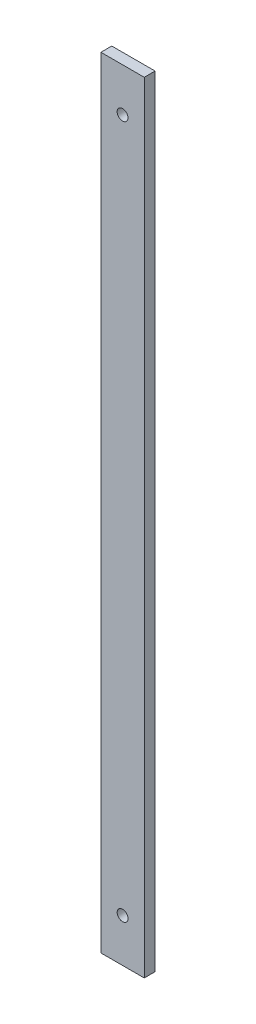
ISO-10303-21;
HEADER;
FILE_DESCRIPTION(('STEP AP214'),'2;1');
FILE_NAME('part.step','',(''),(''),'','','');
FILE_SCHEMA(('AUTOMOTIVE_DESIGN { 1 0 10303 214 1 1 1 1 }'));
ENDSEC;
DATA;
#1=APPLICATION_CONTEXT('core data for automotive mechanical design processes');
#2=APPLICATION_PROTOCOL_DEFINITION('international standard','automotive_design',2000,#1);
#3=PRODUCT_CONTEXT('',#1,'mechanical');
#4=PRODUCT('Part','Part','',(#3));
#5=PRODUCT_RELATED_PRODUCT_CATEGORY('part','',(#4));
#6=PRODUCT_DEFINITION_FORMATION('','',#4);
#7=PRODUCT_DEFINITION_CONTEXT('part definition',#1,'design');
#8=PRODUCT_DEFINITION('design','',#6,#7);
#9=PRODUCT_DEFINITION_SHAPE('','',#8);
#10=(LENGTH_UNIT() NAMED_UNIT(*) SI_UNIT(.MILLI.,.METRE.));
#11=(NAMED_UNIT(*) PLANE_ANGLE_UNIT() SI_UNIT($,.RADIAN.));
#12=(NAMED_UNIT(*) SI_UNIT($,.STERADIAN.) SOLID_ANGLE_UNIT());
#13=UNCERTAINTY_MEASURE_WITH_UNIT(LENGTH_MEASURE(1.E-05),#10,'distance_accuracy_value','');
#14=(GEOMETRIC_REPRESENTATION_CONTEXT(3) GLOBAL_UNCERTAINTY_ASSIGNED_CONTEXT((#13)) GLOBAL_UNIT_ASSIGNED_CONTEXT((#10,
#11,#12)) REPRESENTATION_CONTEXT('',''));
#15=CARTESIAN_POINT('',(0.,0.,0.));
#16=DIRECTION('',(0.,0.,1.));
#17=DIRECTION('',(1.,0.,0.));
#18=AXIS2_PLACEMENT_3D('',#15,#16,#17);
#19=CARTESIAN_POINT('',(-50.8,0.,25.4));
#20=DIRECTION('',(1.,0.,0.));
#21=DIRECTION('',(0.,0.,-1.));
#22=AXIS2_PLACEMENT_3D('',#19,#20,#21);
#23=PLANE('',#22);
#24=DIRECTION('',(0.,-1.,0.));
#25=VECTOR('',#24,1.);
#26=CARTESIAN_POINT('',(-50.8,0.,0.));
#27=LINE('',#26,#25);
#28=CARTESIAN_POINT('',(-50.8,1828.8,0.));
#29=VERTEX_POINT('',#28);
#30=CARTESIAN_POINT('',(-50.8,0.,0.));
#31=VERTEX_POINT('',#30);
#32=EDGE_CURVE('E98',#29,#31,#27,.T.);
#33=ORIENTED_EDGE('',*,*,#32,.T.);
#34=DIRECTION('',(0.,0.,-1.));
#35=VECTOR('',#34,1.);
#36=CARTESIAN_POINT('',(-50.8,0.,25.4));
#37=LINE('',#36,#35);
#38=CARTESIAN_POINT('',(-50.8,0.,25.4));
#39=VERTEX_POINT('',#38);
#40=EDGE_CURVE('E11',#39,#31,#37,.T.);
#41=ORIENTED_EDGE('',*,*,#40,.F.);
#42=DIRECTION('',(0.,-1.,0.));
#43=VECTOR('',#42,1.);
#44=CARTESIAN_POINT('',(-50.8,0.,25.4));
#45=LINE('',#44,#43);
#46=CARTESIAN_POINT('',(-50.8,1828.8,25.4));
#47=VERTEX_POINT('',#46);
#48=EDGE_CURVE('E86',#47,#39,#45,.T.);
#49=ORIENTED_EDGE('',*,*,#48,.F.);
#50=DIRECTION('',(0.,0.,-1.));
#51=VECTOR('',#50,1.);
#52=CARTESIAN_POINT('',(-50.8,1828.8,25.4));
#53=LINE('',#52,#51);
#54=EDGE_CURVE('E94',#47,#29,#53,.T.);
#55=ORIENTED_EDGE('',*,*,#54,.T.);
#56=EDGE_LOOP('',(#33,#41,#49,#55));
#57=FACE_BOUND('',#56,.T.);
#58=ADVANCED_FACE('F35',(#57),#23,.F.);
#59=CARTESIAN_POINT('',(-50.8,0.,25.4));
#60=DIRECTION('',(0.,1.,0.));
#61=DIRECTION('',(-1.,0.,0.));
#62=AXIS2_PLACEMENT_3D('',#59,#60,#61);
#63=PLANE('',#62);
#64=DIRECTION('',(1.,0.,0.));
#65=VECTOR('',#64,1.);
#66=CARTESIAN_POINT('',(-50.8,0.,0.));
#67=LINE('',#66,#65);
#68=CARTESIAN_POINT('',(50.8,0.,0.));
#69=VERTEX_POINT('',#68);
#70=EDGE_CURVE('E90',#31,#69,#67,.T.);
#71=ORIENTED_EDGE('',*,*,#70,.T.);
#72=DIRECTION('',(0.,0.,-1.));
#73=VECTOR('',#72,1.);
#74=CARTESIAN_POINT('',(50.8,0.,25.4));
#75=LINE('',#74,#73);
#76=CARTESIAN_POINT('',(50.8,0.,25.4));
#77=VERTEX_POINT('',#76);
#78=EDGE_CURVE('E43',#77,#69,#75,.T.);
#79=ORIENTED_EDGE('',*,*,#78,.F.);
#80=DIRECTION('',(1.,0.,0.));
#81=VECTOR('',#80,1.);
#82=CARTESIAN_POINT('',(-50.8,0.,25.4));
#83=LINE('',#82,#81);
#84=EDGE_CURVE('E81',#39,#77,#83,.T.);
#85=ORIENTED_EDGE('',*,*,#84,.F.);
#86=ORIENTED_EDGE('',*,*,#40,.T.);
#87=EDGE_LOOP('',(#71,#79,#85,#86));
#88=FACE_BOUND('',#87,.T.);
#89=ADVANCED_FACE('F89',(#88),#63,.F.);
#90=CARTESIAN_POINT('',(50.8,0.,25.4));
#91=DIRECTION('',(-1.,0.,0.));
#92=DIRECTION('',(0.,-1.,0.));
#93=AXIS2_PLACEMENT_3D('',#90,#91,#92);
#94=PLANE('',#93);
#95=DIRECTION('',(0.,1.,0.));
#96=VECTOR('',#95,1.);
#97=CARTESIAN_POINT('',(50.8,0.,0.));
#98=LINE('',#97,#96);
#99=CARTESIAN_POINT('',(50.7999999999998,1828.8,0.));
#100=VERTEX_POINT('',#99);
#101=EDGE_CURVE('E68',#69,#100,#98,.T.);
#102=ORIENTED_EDGE('',*,*,#101,.T.);
#103=DIRECTION('',(0.,0.,-1.));
#104=VECTOR('',#103,1.);
#105=CARTESIAN_POINT('',(50.7999999999998,1828.8,25.4));
#106=LINE('',#105,#104);
#107=CARTESIAN_POINT('',(50.7999999999998,1828.8,25.4));
#108=VERTEX_POINT('',#107);
#109=EDGE_CURVE('E91',#108,#100,#106,.T.);
#110=ORIENTED_EDGE('',*,*,#109,.F.);
#111=DIRECTION('',(0.,1.,0.));
#112=VECTOR('',#111,1.);
#113=CARTESIAN_POINT('',(50.8,0.,25.4));
#114=LINE('',#113,#112);
#115=EDGE_CURVE('E84',#77,#108,#114,.T.);
#116=ORIENTED_EDGE('',*,*,#115,.F.);
#117=ORIENTED_EDGE('',*,*,#78,.T.);
#118=EDGE_LOOP('',(#102,#110,#116,#117));
#119=FACE_BOUND('',#118,.T.);
#120=ADVANCED_FACE('F92',(#119),#94,.F.);
#121=CARTESIAN_POINT('',(-50.8,1828.8,25.4));
#122=DIRECTION('',(0.,-1.,0.));
#123=DIRECTION('',(0.,0.,-1.));
#124=AXIS2_PLACEMENT_3D('',#121,#122,#123);
#125=PLANE('',#124);
#126=DIRECTION('',(-1.,0.,0.));
#127=VECTOR('',#126,1.);
#128=CARTESIAN_POINT('',(-50.8,1828.8,0.));
#129=LINE('',#128,#127);
#130=EDGE_CURVE('E74',#100,#29,#129,.T.);
#131=ORIENTED_EDGE('',*,*,#130,.T.);
#132=ORIENTED_EDGE('',*,*,#54,.F.);
#133=DIRECTION('',(-1.,0.,0.));
#134=VECTOR('',#133,1.);
#135=CARTESIAN_POINT('',(-50.8,1828.8,25.4));
#136=LINE('',#135,#134);
#137=EDGE_CURVE('E51',#108,#47,#136,.T.);
#138=ORIENTED_EDGE('',*,*,#137,.F.);
#139=ORIENTED_EDGE('',*,*,#109,.T.);
#140=EDGE_LOOP('',(#131,#132,#138,#139));
#141=FACE_BOUND('',#140,.T.);
#142=ADVANCED_FACE('F106',(#141),#125,.F.);
#143=CARTESIAN_POINT('',(0.,0.,25.4));
#144=DIRECTION('',(0.,0.,-1.));
#145=DIRECTION('',(-1.,0.,0.));
#146=AXIS2_PLACEMENT_3D('',#143,#144,#145);
#147=PLANE('',#146);
#148=CARTESIAN_POINT('',(2.30184612367736E-13,101.6,25.4));
#149=DIRECTION('',(0.,0.,1.));
#150=DIRECTION('',(1.,0.,0.));
#151=AXIS2_PLACEMENT_3D('',#148,#149,#150);
#152=CIRCLE('',#151,12.7);
#153=CARTESIAN_POINT('',(12.7000000000002,101.6,25.4));
#154=VERTEX_POINT('',#153);
#155=EDGE_CURVE('E118',#154,#154,#152,.T.);
#156=ORIENTED_EDGE('',*,*,#155,.F.);
#157=EDGE_LOOP('',(#156));
#158=FACE_BOUND('',#157,.T.);
#159=CARTESIAN_POINT('',(0.,1727.2,25.4));
#160=DIRECTION('',(0.,0.,1.));
#161=DIRECTION('',(1.,0.,0.));
#162=AXIS2_PLACEMENT_3D('',#159,#160,#161);
#163=CIRCLE('',#162,12.7);
#164=CARTESIAN_POINT('',(12.7,1727.2,25.4));
#165=VERTEX_POINT('',#164);
#166=EDGE_CURVE('E112',#165,#165,#163,.T.);
#167=ORIENTED_EDGE('',*,*,#166,.F.);
#168=EDGE_LOOP('',(#167));
#169=FACE_BOUND('',#168,.T.);
#170=ORIENTED_EDGE('',*,*,#48,.T.);
#171=ORIENTED_EDGE('',*,*,#84,.T.);
#172=ORIENTED_EDGE('',*,*,#115,.T.);
#173=ORIENTED_EDGE('',*,*,#137,.T.);
#174=EDGE_LOOP('',(#170,#171,#172,#173));
#175=FACE_BOUND('',#174,.T.);
#176=ADVANCED_FACE('F82',(#158,#169,#175),#147,.F.);
#177=CARTESIAN_POINT('',(0.,0.,0.));
#178=DIRECTION('',(0.,0.,-1.));
#179=DIRECTION('',(-1.,0.,0.));
#180=AXIS2_PLACEMENT_3D('',#177,#178,#179);
#181=PLANE('',#180);
#182=CARTESIAN_POINT('',(2.30184612367736E-13,101.6,0.));
#183=DIRECTION('',(0.,0.,1.));
#184=DIRECTION('',(1.,0.,0.));
#185=AXIS2_PLACEMENT_3D('',#182,#183,#184);
#186=CIRCLE('',#185,12.7);
#187=CARTESIAN_POINT('',(12.7000000000002,101.6,0.));
#188=VERTEX_POINT('',#187);
#189=EDGE_CURVE('E115',#188,#188,#186,.T.);
#190=ORIENTED_EDGE('',*,*,#189,.T.);
#191=EDGE_LOOP('',(#190));
#192=FACE_BOUND('',#191,.T.);
#193=CARTESIAN_POINT('',(0.,1727.2,0.));
#194=DIRECTION('',(0.,0.,1.));
#195=DIRECTION('',(1.,0.,0.));
#196=AXIS2_PLACEMENT_3D('',#193,#194,#195);
#197=CIRCLE('',#196,12.7);
#198=CARTESIAN_POINT('',(12.7,1727.2,0.));
#199=VERTEX_POINT('',#198);
#200=EDGE_CURVE('E101',#199,#199,#197,.T.);
#201=ORIENTED_EDGE('',*,*,#200,.T.);
#202=EDGE_LOOP('',(#201));
#203=FACE_BOUND('',#202,.T.);
#204=ORIENTED_EDGE('',*,*,#32,.F.);
#205=ORIENTED_EDGE('',*,*,#130,.F.);
#206=ORIENTED_EDGE('',*,*,#101,.F.);
#207=ORIENTED_EDGE('',*,*,#70,.F.);
#208=EDGE_LOOP('',(#204,#205,#206,#207));
#209=FACE_BOUND('',#208,.T.);
#210=ADVANCED_FACE('F109',(#192,#203,#209),#181,.T.);
#211=CARTESIAN_POINT('',(0.,1727.2,0.));
#212=DIRECTION('',(0.,0.,1.));
#213=DIRECTION('',(1.,0.,0.));
#214=AXIS2_PLACEMENT_3D('',#211,#212,#213);
#215=CYLINDRICAL_SURFACE('',#214,12.7);
#216=ORIENTED_EDGE('',*,*,#200,.F.);
#217=EDGE_LOOP('',(#216));
#218=FACE_BOUND('',#217,.T.);
#219=ORIENTED_EDGE('',*,*,#166,.T.);
#220=EDGE_LOOP('',(#219));
#221=FACE_BOUND('',#220,.T.);
#222=ADVANCED_FACE('F129',(#218,#221),#215,.F.);
#223=CARTESIAN_POINT('',(2.30184612367736E-13,101.6,0.));
#224=DIRECTION('',(0.,0.,1.));
#225=DIRECTION('',(1.,0.,0.));
#226=AXIS2_PLACEMENT_3D('',#223,#224,#225);
#227=CYLINDRICAL_SURFACE('',#226,12.7);
#228=ORIENTED_EDGE('',*,*,#189,.F.);
#229=EDGE_LOOP('',(#228));
#230=FACE_BOUND('',#229,.T.);
#231=ORIENTED_EDGE('',*,*,#155,.T.);
#232=EDGE_LOOP('',(#231));
#233=FACE_BOUND('',#232,.T.);
#234=ADVANCED_FACE('F126',(#230,#233),#227,.F.);
#235=CLOSED_SHELL('',(#58,#89,#120,#142,#176,#210,#222,#234));
#236=MANIFOLD_SOLID_BREP('B2',#235);
#237=ADVANCED_BREP_SHAPE_REPRESENTATION('',(#18,#236),#14);
#238=SHAPE_DEFINITION_REPRESENTATION(#9,#237);
ENDSEC;
END-ISO-10303-21;
